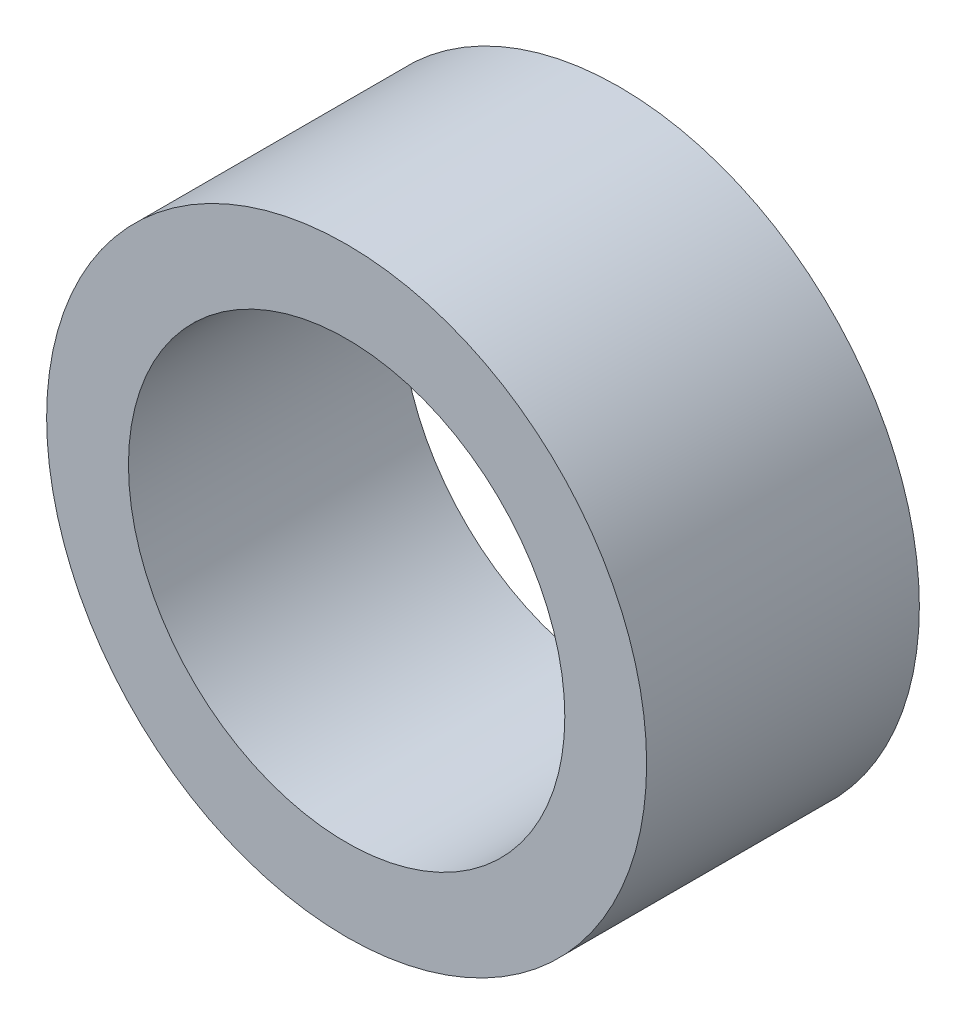
ISO-10303-21;
HEADER;
FILE_DESCRIPTION(('STEP AP214'),'2;1');
FILE_NAME('part.step','',(''),(''),'','','');
FILE_SCHEMA(('AUTOMOTIVE_DESIGN { 1 0 10303 214 1 1 1 1 }'));
ENDSEC;
DATA;
#1=APPLICATION_CONTEXT('core data for automotive mechanical design processes');
#2=APPLICATION_PROTOCOL_DEFINITION('international standard','automotive_design',2000,#1);
#3=PRODUCT_CONTEXT('',#1,'mechanical');
#4=PRODUCT('Part','Part','',(#3));
#5=PRODUCT_RELATED_PRODUCT_CATEGORY('part','',(#4));
#6=PRODUCT_DEFINITION_FORMATION('','',#4);
#7=PRODUCT_DEFINITION_CONTEXT('part definition',#1,'design');
#8=PRODUCT_DEFINITION('design','',#6,#7);
#9=PRODUCT_DEFINITION_SHAPE('','',#8);
#10=(LENGTH_UNIT() NAMED_UNIT(*) SI_UNIT(.MILLI.,.METRE.));
#11=(NAMED_UNIT(*) PLANE_ANGLE_UNIT() SI_UNIT($,.RADIAN.));
#12=(NAMED_UNIT(*) SI_UNIT($,.STERADIAN.) SOLID_ANGLE_UNIT());
#13=UNCERTAINTY_MEASURE_WITH_UNIT(LENGTH_MEASURE(1.E-05),#10,'distance_accuracy_value','');
#14=(GEOMETRIC_REPRESENTATION_CONTEXT(3) GLOBAL_UNCERTAINTY_ASSIGNED_CONTEXT((#13)) GLOBAL_UNIT_ASSIGNED_CONTEXT((#10,
#11,#12)) REPRESENTATION_CONTEXT('',''));
#15=CARTESIAN_POINT('',(0.,0.,0.));
#16=DIRECTION('',(0.,0.,1.));
#17=DIRECTION('',(1.,0.,0.));
#18=AXIS2_PLACEMENT_3D('',#15,#16,#17);
#19=CARTESIAN_POINT('',(0.,0.,5.));
#20=DIRECTION('',(0.,0.,1.));
#21=DIRECTION('',(1.,0.,0.));
#22=AXIS2_PLACEMENT_3D('',#19,#20,#21);
#23=PLANE('',#22);
#24=CARTESIAN_POINT('',(0.,0.,5.));
#25=DIRECTION('',(0.,0.,1.));
#26=DIRECTION('',(1.,0.,0.));
#27=AXIS2_PLACEMENT_3D('',#24,#25,#26);
#28=CIRCLE('',#27,11.);
#29=CARTESIAN_POINT('',(11.,0.,5.));
#30=VERTEX_POINT('',#29);
#31=EDGE_CURVE('E10',#30,#30,#28,.T.);
#32=ORIENTED_EDGE('',*,*,#31,.T.);
#33=EDGE_LOOP('',(#32));
#34=FACE_BOUND('',#33,.T.);
#35=CARTESIAN_POINT('',(0.,0.,5.));
#36=DIRECTION('',(0.,0.,1.));
#37=DIRECTION('',(1.,0.,0.));
#38=AXIS2_PLACEMENT_3D('',#35,#36,#37);
#39=CIRCLE('',#38,8.);
#40=CARTESIAN_POINT('',(8.,0.,5.));
#41=VERTEX_POINT('',#40);
#42=EDGE_CURVE('E48',#41,#41,#39,.T.);
#43=ORIENTED_EDGE('',*,*,#42,.F.);
#44=EDGE_LOOP('',(#43));
#45=FACE_BOUND('',#44,.T.);
#46=ADVANCED_FACE('F40',(#34,#45),#23,.T.);
#47=CARTESIAN_POINT('',(0.,0.,-5.));
#48=DIRECTION('',(0.,0.,1.));
#49=DIRECTION('',(1.,0.,0.));
#50=AXIS2_PLACEMENT_3D('',#47,#48,#49);
#51=PLANE('',#50);
#52=CARTESIAN_POINT('',(0.,0.,-5.));
#53=DIRECTION('',(0.,0.,1.));
#54=DIRECTION('',(1.,0.,0.));
#55=AXIS2_PLACEMENT_3D('',#52,#53,#54);
#56=CIRCLE('',#55,11.);
#57=CARTESIAN_POINT('',(11.,0.,-5.));
#58=VERTEX_POINT('',#57);
#59=EDGE_CURVE('E41',#58,#58,#56,.T.);
#60=ORIENTED_EDGE('',*,*,#59,.F.);
#61=EDGE_LOOP('',(#60));
#62=FACE_BOUND('',#61,.T.);
#63=CARTESIAN_POINT('',(0.,0.,-5.));
#64=DIRECTION('',(0.,0.,1.));
#65=DIRECTION('',(1.,0.,0.));
#66=AXIS2_PLACEMENT_3D('',#63,#64,#65);
#67=CIRCLE('',#66,8.);
#68=CARTESIAN_POINT('',(8.,0.,-5.));
#69=VERTEX_POINT('',#68);
#70=EDGE_CURVE('E49',#69,#69,#67,.T.);
#71=ORIENTED_EDGE('',*,*,#70,.T.);
#72=EDGE_LOOP('',(#71));
#73=FACE_BOUND('',#72,.T.);
#74=ADVANCED_FACE('F58',(#62,#73),#51,.F.);
#75=CARTESIAN_POINT('',(0.,0.,5.));
#76=DIRECTION('',(0.,0.,-1.));
#77=DIRECTION('',(-1.,0.,0.));
#78=AXIS2_PLACEMENT_3D('',#75,#76,#77);
#79=CYLINDRICAL_SURFACE('',#78,11.);
#80=ORIENTED_EDGE('',*,*,#31,.F.);
#81=EDGE_LOOP('',(#80));
#82=FACE_BOUND('',#81,.T.);
#83=ORIENTED_EDGE('',*,*,#59,.T.);
#84=EDGE_LOOP('',(#83));
#85=FACE_BOUND('',#84,.T.);
#86=ADVANCED_FACE('F39',(#82,#85),#79,.T.);
#87=CARTESIAN_POINT('',(0.,0.,5.));
#88=DIRECTION('',(0.,0.,-1.));
#89=DIRECTION('',(-1.,0.,0.));
#90=AXIS2_PLACEMENT_3D('',#87,#88,#89);
#91=CYLINDRICAL_SURFACE('',#90,8.);
#92=ORIENTED_EDGE('',*,*,#42,.T.);
#93=EDGE_LOOP('',(#92));
#94=FACE_BOUND('',#93,.T.);
#95=ORIENTED_EDGE('',*,*,#70,.F.);
#96=EDGE_LOOP('',(#95));
#97=FACE_BOUND('',#96,.T.);
#98=ADVANCED_FACE('F57',(#94,#97),#91,.F.);
#99=CLOSED_SHELL('',(#46,#74,#86,#98));
#100=MANIFOLD_SOLID_BREP('B2',#99);
#101=ADVANCED_BREP_SHAPE_REPRESENTATION('',(#18,#100),#14);
#102=SHAPE_DEFINITION_REPRESENTATION(#9,#101);
ENDSEC;
END-ISO-10303-21;
